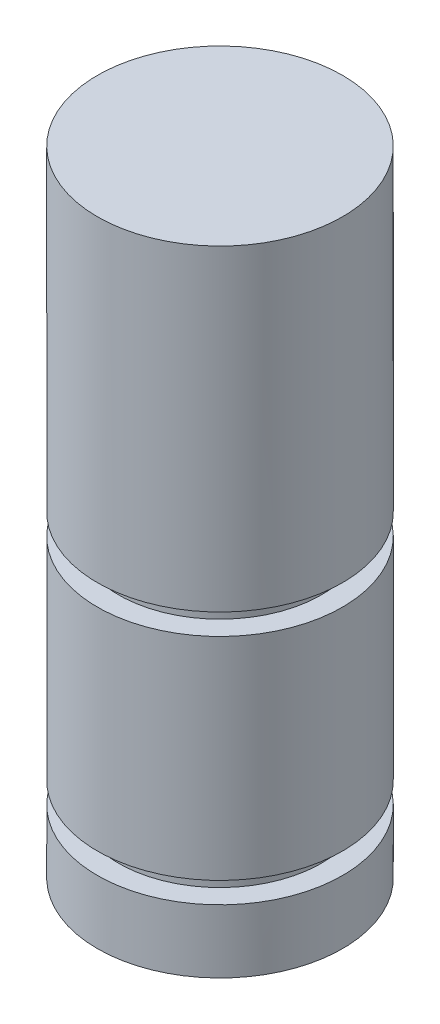
ISO-10303-21;
HEADER;
FILE_DESCRIPTION(('STEP AP214'),'2;1');
FILE_NAME('part.step','',(''),(''),'','','');
FILE_SCHEMA(('AUTOMOTIVE_DESIGN { 1 0 10303 214 1 1 1 1 }'));
ENDSEC;
DATA;
#1=APPLICATION_CONTEXT('core data for automotive mechanical design processes');
#2=APPLICATION_PROTOCOL_DEFINITION('international standard','automotive_design',2000,#1);
#3=PRODUCT_CONTEXT('',#1,'mechanical');
#4=PRODUCT('Part','Part','',(#3));
#5=PRODUCT_RELATED_PRODUCT_CATEGORY('part','',(#4));
#6=PRODUCT_DEFINITION_FORMATION('','',#4);
#7=PRODUCT_DEFINITION_CONTEXT('part definition',#1,'design');
#8=PRODUCT_DEFINITION('design','',#6,#7);
#9=PRODUCT_DEFINITION_SHAPE('','',#8);
#10=(LENGTH_UNIT() NAMED_UNIT(*) SI_UNIT(.MILLI.,.METRE.));
#11=(NAMED_UNIT(*) PLANE_ANGLE_UNIT() SI_UNIT($,.RADIAN.));
#12=(NAMED_UNIT(*) SI_UNIT($,.STERADIAN.) SOLID_ANGLE_UNIT());
#13=UNCERTAINTY_MEASURE_WITH_UNIT(LENGTH_MEASURE(1.E-05),#10,'distance_accuracy_value','');
#14=(GEOMETRIC_REPRESENTATION_CONTEXT(3) GLOBAL_UNCERTAINTY_ASSIGNED_CONTEXT((#13)) GLOBAL_UNIT_ASSIGNED_CONTEXT((#10,
#11,#12)) REPRESENTATION_CONTEXT('',''));
#15=CARTESIAN_POINT('',(0.,0.,0.));
#16=DIRECTION('',(0.,0.,1.));
#17=DIRECTION('',(1.,0.,0.));
#18=AXIS2_PLACEMENT_3D('',#15,#16,#17);
#19=CARTESIAN_POINT('',(0.,30.,0.));
#20=DIRECTION('',(0.,-1.,0.));
#21=DIRECTION('',(0.,0.,-1.));
#22=AXIS2_PLACEMENT_3D('',#19,#20,#21);
#23=CYLINDRICAL_SURFACE('',#22,5.8);
#24=CARTESIAN_POINT('',(0.,14.,0.));
#25=DIRECTION('',(0.,-1.,0.));
#26=DIRECTION('',(0.,0.,-1.));
#27=AXIS2_PLACEMENT_3D('',#24,#25,#26);
#28=CIRCLE('',#27,5.8);
#29=CARTESIAN_POINT('',(0.,14.,-5.8));
#30=VERTEX_POINT('',#29);
#31=EDGE_CURVE('E59',#30,#30,#28,.T.);
#32=ORIENTED_EDGE('',*,*,#31,.T.);
#33=EDGE_LOOP('',(#32));
#34=FACE_BOUND('',#33,.T.);
#35=CARTESIAN_POINT('',(0.,3.99999999999998,0.));
#36=DIRECTION('',(0.,-1.,0.));
#37=DIRECTION('',(0.,0.,-1.));
#38=AXIS2_PLACEMENT_3D('',#35,#36,#37);
#39=CIRCLE('',#38,5.8);
#40=CARTESIAN_POINT('',(0.,3.99999999999998,-5.8));
#41=VERTEX_POINT('',#40);
#42=EDGE_CURVE('E71',#41,#41,#39,.T.);
#43=ORIENTED_EDGE('',*,*,#42,.F.);
#44=EDGE_LOOP('',(#43));
#45=FACE_BOUND('',#44,.T.);
#46=ADVANCED_FACE('F40',(#34,#45),#23,.T.);
#47=CARTESIAN_POINT('',(0.,15.,0.));
#48=DIRECTION('',(0.,-1.,0.));
#49=DIRECTION('',(0.,0.,-1.));
#50=AXIS2_PLACEMENT_3D('',#47,#48,#49);
#51=PLANE('',#50);
#52=CARTESIAN_POINT('',(0.,15.,0.));
#53=DIRECTION('',(0.,-1.,0.));
#54=DIRECTION('',(0.,0.,-1.));
#55=AXIS2_PLACEMENT_3D('',#52,#53,#54);
#56=CIRCLE('',#55,4.8);
#57=CARTESIAN_POINT('',(0.,15.,-4.8));
#58=VERTEX_POINT('',#57);
#59=EDGE_CURVE('E62',#58,#58,#56,.T.);
#60=ORIENTED_EDGE('',*,*,#59,.F.);
#61=EDGE_LOOP('',(#60));
#62=FACE_BOUND('',#61,.T.);
#63=CARTESIAN_POINT('',(0.,15.,0.));
#64=DIRECTION('',(0.,-1.,0.));
#65=DIRECTION('',(0.,0.,-1.));
#66=AXIS2_PLACEMENT_3D('',#63,#64,#65);
#67=CIRCLE('',#66,5.8);
#68=CARTESIAN_POINT('',(0.,15.,-5.8));
#69=VERTEX_POINT('',#68);
#70=EDGE_CURVE('E56',#69,#69,#67,.T.);
#71=ORIENTED_EDGE('',*,*,#70,.T.);
#72=EDGE_LOOP('',(#71));
#73=FACE_BOUND('',#72,.T.);
#74=ADVANCED_FACE('F104',(#62,#73),#51,.T.);
#75=CARTESIAN_POINT('',(0.,14.,0.));
#76=DIRECTION('',(0.,-1.,0.));
#77=DIRECTION('',(0.,0.,-1.));
#78=AXIS2_PLACEMENT_3D('',#75,#76,#77);
#79=PLANE('',#78);
#80=CARTESIAN_POINT('',(0.,14.,0.));
#81=DIRECTION('',(0.,-1.,0.));
#82=DIRECTION('',(0.,0.,-1.));
#83=AXIS2_PLACEMENT_3D('',#80,#81,#82);
#84=CIRCLE('',#83,4.8);
#85=CARTESIAN_POINT('',(0.,14.,-4.8));
#86=VERTEX_POINT('',#85);
#87=EDGE_CURVE('E65',#86,#86,#84,.T.);
#88=ORIENTED_EDGE('',*,*,#87,.T.);
#89=EDGE_LOOP('',(#88));
#90=FACE_BOUND('',#89,.T.);
#91=ORIENTED_EDGE('',*,*,#31,.F.);
#92=EDGE_LOOP('',(#91));
#93=FACE_BOUND('',#92,.T.);
#94=ADVANCED_FACE('F109',(#90,#93),#79,.F.);
#95=CARTESIAN_POINT('',(0.,15.,0.));
#96=DIRECTION('',(0.,-1.,0.));
#97=DIRECTION('',(0.,0.,-1.));
#98=AXIS2_PLACEMENT_3D('',#95,#96,#97);
#99=CYLINDRICAL_SURFACE('',#98,4.8);
#100=ORIENTED_EDGE('',*,*,#59,.T.);
#101=EDGE_LOOP('',(#100));
#102=FACE_BOUND('',#101,.T.);
#103=ORIENTED_EDGE('',*,*,#87,.F.);
#104=EDGE_LOOP('',(#103));
#105=FACE_BOUND('',#104,.T.);
#106=ADVANCED_FACE('F136',(#102,#105),#99,.T.);
#107=CARTESIAN_POINT('',(0.,30.,0.));
#108=DIRECTION('',(0.,1.,0.));
#109=DIRECTION('',(0.,0.,1.));
#110=AXIS2_PLACEMENT_3D('',#107,#108,#109);
#111=PLANE('',#110);
#112=CARTESIAN_POINT('',(0.,30.,0.));
#113=DIRECTION('',(0.,1.,0.));
#114=DIRECTION('',(0.,0.,1.));
#115=AXIS2_PLACEMENT_3D('',#112,#113,#114);
#116=CIRCLE('',#115,5.8);
#117=CARTESIAN_POINT('',(0.,30.,5.8));
#118=VERTEX_POINT('',#117);
#119=EDGE_CURVE('E10',#118,#118,#116,.T.);
#120=ORIENTED_EDGE('',*,*,#119,.T.);
#121=EDGE_LOOP('',(#120));
#122=FACE_BOUND('',#121,.T.);
#123=ADVANCED_FACE('F114',(#122),#111,.T.);
#124=ORIENTED_EDGE('',*,*,#119,.F.);
#125=EDGE_LOOP('',(#124));
#126=FACE_BOUND('',#125,.T.);
#127=ORIENTED_EDGE('',*,*,#70,.F.);
#128=EDGE_LOOP('',(#127));
#129=FACE_BOUND('',#128,.T.);
#130=ADVANCED_FACE('F99',(#126,#129),#23,.T.);
#131=CARTESIAN_POINT('',(0.,2.99999999999998,0.));
#132=DIRECTION('',(0.,-1.,0.));
#133=DIRECTION('',(0.,0.,-1.));
#134=AXIS2_PLACEMENT_3D('',#131,#132,#133);
#135=PLANE('',#134);
#136=CARTESIAN_POINT('',(0.,2.99999999999998,0.));
#137=DIRECTION('',(0.,-1.,0.));
#138=DIRECTION('',(0.,0.,-1.));
#139=AXIS2_PLACEMENT_3D('',#136,#137,#138);
#140=CIRCLE('',#139,5.8);
#141=CARTESIAN_POINT('',(0.,2.99999999999998,-5.8));
#142=VERTEX_POINT('',#141);
#143=EDGE_CURVE('E68',#142,#142,#140,.T.);
#144=ORIENTED_EDGE('',*,*,#143,.F.);
#145=EDGE_LOOP('',(#144));
#146=FACE_BOUND('',#145,.T.);
#147=CARTESIAN_POINT('',(0.,2.99999999999998,0.));
#148=DIRECTION('',(0.,-1.,0.));
#149=DIRECTION('',(0.,0.,-1.));
#150=AXIS2_PLACEMENT_3D('',#147,#148,#149);
#151=CIRCLE('',#150,4.8);
#152=CARTESIAN_POINT('',(0.,2.99999999999998,-4.8));
#153=VERTEX_POINT('',#152);
#154=EDGE_CURVE('E74',#153,#153,#151,.T.);
#155=ORIENTED_EDGE('',*,*,#154,.T.);
#156=EDGE_LOOP('',(#155));
#157=FACE_BOUND('',#156,.T.);
#158=ADVANCED_FACE('F83',(#146,#157),#135,.F.);
#159=CARTESIAN_POINT('',(0.,3.99999999999998,0.));
#160=DIRECTION('',(0.,-1.,0.));
#161=DIRECTION('',(0.,0.,-1.));
#162=AXIS2_PLACEMENT_3D('',#159,#160,#161);
#163=PLANE('',#162);
#164=ORIENTED_EDGE('',*,*,#42,.T.);
#165=EDGE_LOOP('',(#164));
#166=FACE_BOUND('',#165,.T.);
#167=CARTESIAN_POINT('',(0.,3.99999999999998,0.));
#168=DIRECTION('',(0.,-1.,0.));
#169=DIRECTION('',(0.,0.,-1.));
#170=AXIS2_PLACEMENT_3D('',#167,#168,#169);
#171=CIRCLE('',#170,4.8);
#172=CARTESIAN_POINT('',(0.,3.99999999999998,-4.8));
#173=VERTEX_POINT('',#172);
#174=EDGE_CURVE('E77',#173,#173,#171,.T.);
#175=ORIENTED_EDGE('',*,*,#174,.F.);
#176=EDGE_LOOP('',(#175));
#177=FACE_BOUND('',#176,.T.);
#178=ADVANCED_FACE('F89',(#166,#177),#163,.T.);
#179=CARTESIAN_POINT('',(0.,2.99999999999998,0.));
#180=DIRECTION('',(0.,1.,0.));
#181=DIRECTION('',(0.,0.,1.));
#182=AXIS2_PLACEMENT_3D('',#179,#180,#181);
#183=CYLINDRICAL_SURFACE('',#182,4.8);
#184=ORIENTED_EDGE('',*,*,#154,.F.);
#185=EDGE_LOOP('',(#184));
#186=FACE_BOUND('',#185,.T.);
#187=ORIENTED_EDGE('',*,*,#174,.T.);
#188=EDGE_LOOP('',(#187));
#189=FACE_BOUND('',#188,.T.);
#190=ADVANCED_FACE('F85',(#186,#189),#183,.T.);
#191=CARTESIAN_POINT('',(0.,10.,0.));
#192=DIRECTION('',(0.,-1.,0.));
#193=DIRECTION('',(0.,0.,-1.));
#194=AXIS2_PLACEMENT_3D('',#191,#192,#193);
#195=PLANE('',#194);
#196=CARTESIAN_POINT('',(0.,10.,0.));
#197=DIRECTION('',(0.,-1.,0.));
#198=DIRECTION('',(0.,0.,-1.));
#199=AXIS2_PLACEMENT_3D('',#196,#197,#198);
#200=CIRCLE('',#199,2.1);
#201=CARTESIAN_POINT('',(0.,10.,-2.1));
#202=VERTEX_POINT('',#201);
#203=EDGE_CURVE('E51',#202,#202,#200,.T.);
#204=ORIENTED_EDGE('',*,*,#203,.T.);
#205=EDGE_LOOP('',(#204));
#206=FACE_BOUND('',#205,.T.);
#207=ADVANCED_FACE('F88',(#206),#195,.T.);
#208=CARTESIAN_POINT('',(0.,10.,0.));
#209=DIRECTION('',(0.,-1.,0.));
#210=DIRECTION('',(0.,0.,-1.));
#211=AXIS2_PLACEMENT_3D('',#208,#209,#210);
#212=CYLINDRICAL_SURFACE('',#211,2.1);
#213=ORIENTED_EDGE('',*,*,#203,.F.);
#214=EDGE_LOOP('',(#213));
#215=FACE_BOUND('',#214,.T.);
#216=CARTESIAN_POINT('',(0.,0.,0.));
#217=DIRECTION('',(0.,-1.,0.));
#218=DIRECTION('',(0.,0.,-1.));
#219=AXIS2_PLACEMENT_3D('',#216,#217,#218);
#220=CIRCLE('',#219,2.1);
#221=CARTESIAN_POINT('',(0.,0.,-2.1));
#222=VERTEX_POINT('',#221);
#223=EDGE_CURVE('E53',#222,#222,#220,.T.);
#224=ORIENTED_EDGE('',*,*,#223,.T.);
#225=EDGE_LOOP('',(#224));
#226=FACE_BOUND('',#225,.T.);
#227=ADVANCED_FACE('F122',(#215,#226),#212,.F.);
#228=CARTESIAN_POINT('',(0.,0.,0.));
#229=DIRECTION('',(0.,1.,0.));
#230=DIRECTION('',(0.,0.,1.));
#231=AXIS2_PLACEMENT_3D('',#228,#229,#230);
#232=PLANE('',#231);
#233=ORIENTED_EDGE('',*,*,#223,.F.);
#234=EDGE_LOOP('',(#233));
#235=FACE_BOUND('',#234,.T.);
#236=CARTESIAN_POINT('',(0.,0.,0.));
#237=DIRECTION('',(0.,1.,0.));
#238=DIRECTION('',(0.,0.,1.));
#239=AXIS2_PLACEMENT_3D('',#236,#237,#238);
#240=CIRCLE('',#239,5.8);
#241=CARTESIAN_POINT('',(0.,0.,5.8));
#242=VERTEX_POINT('',#241);
#243=EDGE_CURVE('E44',#242,#242,#240,.T.);
#244=ORIENTED_EDGE('',*,*,#243,.F.);
#245=EDGE_LOOP('',(#244));
#246=FACE_BOUND('',#245,.T.);
#247=ADVANCED_FACE('F117',(#235,#246),#232,.F.);
#248=ORIENTED_EDGE('',*,*,#143,.T.);
#249=EDGE_LOOP('',(#248));
#250=FACE_BOUND('',#249,.T.);
#251=ORIENTED_EDGE('',*,*,#243,.T.);
#252=EDGE_LOOP('',(#251));
#253=FACE_BOUND('',#252,.T.);
#254=ADVANCED_FACE('F42',(#250,#253),#23,.T.);
#255=CLOSED_SHELL('',(#46,#74,#94,#106,#123,#130,#158,#178,#190,#207,#227,#247,#254));
#256=MANIFOLD_SOLID_BREP('B2',#255);
#257=ADVANCED_BREP_SHAPE_REPRESENTATION('',(#18,#256),#14);
#258=SHAPE_DEFINITION_REPRESENTATION(#9,#257);
ENDSEC;
END-ISO-10303-21;
